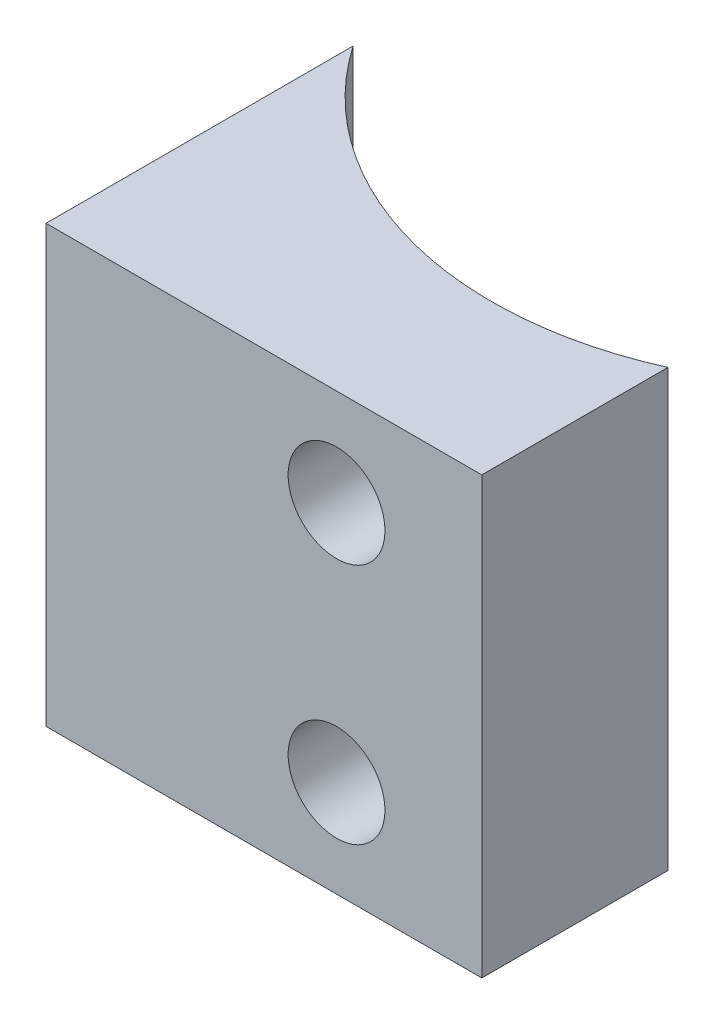
ISO-10303-21;
HEADER;
FILE_DESCRIPTION(('STEP AP214'),'2;1');
FILE_NAME('part.step','',(''),(''),'','','');
FILE_SCHEMA(('AUTOMOTIVE_DESIGN { 1 0 10303 214 1 1 1 1 }'));
ENDSEC;
DATA;
#1=APPLICATION_CONTEXT('core data for automotive mechanical design processes');
#2=APPLICATION_PROTOCOL_DEFINITION('international standard','automotive_design',2000,#1);
#3=PRODUCT_CONTEXT('',#1,'mechanical');
#4=PRODUCT('Part','Part','',(#3));
#5=PRODUCT_RELATED_PRODUCT_CATEGORY('part','',(#4));
#6=PRODUCT_DEFINITION_FORMATION('','',#4);
#7=PRODUCT_DEFINITION_CONTEXT('part definition',#1,'design');
#8=PRODUCT_DEFINITION('design','',#6,#7);
#9=PRODUCT_DEFINITION_SHAPE('','',#8);
#10=(LENGTH_UNIT() NAMED_UNIT(*) SI_UNIT(.MILLI.,.METRE.));
#11=(NAMED_UNIT(*) PLANE_ANGLE_UNIT() SI_UNIT($,.RADIAN.));
#12=(NAMED_UNIT(*) SI_UNIT($,.STERADIAN.) SOLID_ANGLE_UNIT());
#13=UNCERTAINTY_MEASURE_WITH_UNIT(LENGTH_MEASURE(1.E-05),#10,'distance_accuracy_value','');
#14=(GEOMETRIC_REPRESENTATION_CONTEXT(3) GLOBAL_UNCERTAINTY_ASSIGNED_CONTEXT((#13)) GLOBAL_UNIT_ASSIGNED_CONTEXT((#10,
#11,#12)) REPRESENTATION_CONTEXT('',''));
#15=CARTESIAN_POINT('',(0.,0.,0.));
#16=DIRECTION('',(0.,0.,1.));
#17=DIRECTION('',(1.,0.,0.));
#18=AXIS2_PLACEMENT_3D('',#15,#16,#17);
#19=CARTESIAN_POINT('',(0.,-30.,0.));
#20=DIRECTION('',(0.,1.,0.));
#21=DIRECTION('',(0.,0.,1.));
#22=AXIS2_PLACEMENT_3D('',#19,#20,#21);
#23=CYLINDRICAL_SURFACE('',#22,36.5);
#24=CARTESIAN_POINT('',(5.,-20.,36.1559123795818));
#25=CARTESIAN_POINT('',(5.00000174021357,-19.8602338352344,36.1559117231919));
#26=CARTESIAN_POINT('',(4.99413759806774,-19.7204926591787,36.1567244328982));
#27=CARTESIAN_POINT('',(4.97072698097059,-19.441966942433,36.1599505039834));
#28=CARTESIAN_POINT('',(4.95317794339427,-19.3031826183383,36.1623642164793));
#29=CARTESIAN_POINT('',(4.90650841531224,-19.0275106625819,36.1687258133522));
#30=CARTESIAN_POINT('',(4.87737963825514,-18.8906244619859,36.172674796336));
#31=CARTESIAN_POINT('',(4.80775640545662,-18.6197691802201,36.1819942984555));
#32=CARTESIAN_POINT('',(4.76725778332805,-18.4858011878326,36.1873653386513));
#33=CARTESIAN_POINT('',(4.67524918463149,-18.2219257095405,36.1993673004681));
#34=CARTESIAN_POINT('',(4.62375131772126,-18.0920139367682,36.205996835659));
#35=CARTESIAN_POINT('',(4.51007164218422,-17.8369569378413,36.2203331703413));
#36=CARTESIAN_POINT('',(4.44788589768718,-17.7118134884632,36.2280403664917));
#37=CARTESIAN_POINT('',(4.31332539216836,-17.4672761473142,36.2443073031495));
#38=CARTESIAN_POINT('',(4.24095608383687,-17.347879224238,36.2528665867021));
#39=CARTESIAN_POINT('',(4.08648564196615,-17.115541118051,36.2706035061156));
#40=CARTESIAN_POINT('',(4.00438090130522,-17.0026023509,36.279781370623));
#41=CARTESIAN_POINT('',(3.83054594615143,-16.7833875181193,36.2985481878879));
#42=CARTESIAN_POINT('',(3.73876423880966,-16.6771524556949,36.3081391607627));
#43=CARTESIAN_POINT('',(3.54656514669067,-16.4727398263521,36.3274167037392));
#44=CARTESIAN_POINT('',(3.44614457966845,-16.3745652548796,36.3371033078947));
#45=CARTESIAN_POINT('',(3.23742697872434,-16.1870295917347,36.3562930309955));
#46=CARTESIAN_POINT('',(3.12913243813219,-16.0976657310461,36.3657962068284));
#47=CARTESIAN_POINT('',(2.90534790068753,-15.9283110031673,36.3843587554896));
#48=CARTESIAN_POINT('',(2.78985526480078,-15.8483236049971,36.3934179633458));
#49=CARTESIAN_POINT('',(2.55207984561808,-15.6980541225224,36.4108657665965));
#50=CARTESIAN_POINT('',(2.42977393223369,-15.6278083288675,36.419251807839));
#51=CARTESIAN_POINT('',(2.17957364156575,-15.4978514168236,36.4350817279843));
#52=CARTESIAN_POINT('',(2.05167720514956,-15.438144221565,36.4425252557339));
#53=CARTESIAN_POINT('',(1.79128345394976,-15.3297567004876,36.4562515063575));
#54=CARTESIAN_POINT('',(1.65878802225925,-15.2810719214759,36.4625346978321));
#55=CARTESIAN_POINT('',(1.39009491155222,-15.1950468905879,36.4737684227831));
#56=CARTESIAN_POINT('',(1.25389589450601,-15.1577107997157,36.4787184673847));
#57=CARTESIAN_POINT('',(0.843028196941309,-15.0636340584156,36.4912817337303));
#58=CARTESIAN_POINT('',(0.564147727521053,-15.0240198116055,36.4967135006696));
#59=CARTESIAN_POINT('',(0.00380071885447398,-14.9921214878824,36.5010771134938));
#60=CARTESIAN_POINT('',(-0.277665698798489,-14.999835196829,36.5000092634499));
#61=CARTESIAN_POINT('',(-0.833392123587025,-15.0620787384919,36.4915351399092));
#62=CARTESIAN_POINT('',(-1.10768777387907,-15.1162946220146,36.4841713729705));
#63=CARTESIAN_POINT('',(-1.64323991714871,-15.2695285104743,36.4639773139639));
#64=CARTESIAN_POINT('',(-1.90449612093993,-15.3685475085565,36.4511469007179));
#65=CARTESIAN_POINT('',(-2.40752875981016,-15.6089006238871,36.4213886835511));
#66=CARTESIAN_POINT('',(-2.64924028116171,-15.7503689448048,36.4044479177398));
#67=CARTESIAN_POINT('',(-3.10561063137794,-16.0715083503412,36.3683608161024));
#68=CARTESIAN_POINT('',(-3.32026797084505,-16.2511815367673,36.3492143589587));
#69=CARTESIAN_POINT('',(-3.71828543660718,-16.6453847105825,36.310669827647));
#70=CARTESIAN_POINT('',(-3.90137429423767,-16.8601886239288,36.2912709779823));
#71=CARTESIAN_POINT('',(-4.22894445135169,-17.3176195984736,36.2545622390918));
#72=CARTESIAN_POINT('',(-4.37342558167297,-17.5602467815749,36.237252359019));
#73=CARTESIAN_POINT('',(-4.61970417598658,-18.066697401167,36.2066819437005));
#74=CARTESIAN_POINT('',(-4.72147710508501,-18.330532917956,36.1934237372347));
#75=CARTESIAN_POINT('',(-4.87919504088549,-18.8717726121589,36.1725012170257));
#76=CARTESIAN_POINT('',(-4.93514271873473,-19.1491759977048,36.1648365772373));
#77=CARTESIAN_POINT('',(-4.99925692944306,-19.7072730453106,36.156029729936));
#78=CARTESIAN_POINT('',(-5.0078064923179,-19.9879219099059,36.1548352381693));
#79=CARTESIAN_POINT('',(-4.97789502900764,-20.5466481296306,36.1589654177268));
#80=CARTESIAN_POINT('',(-4.93943521226418,-20.8247255507318,36.1642899213326));
#81=CARTESIAN_POINT('',(-4.81692033816778,-21.3692497524291,36.1808103055875));
#82=CARTESIAN_POINT('',(-4.73305319594198,-21.6357396109842,36.19198198181));
#83=CARTESIAN_POINT('',(-4.52229864087699,-22.1508766063494,36.2189181815632));
#84=CARTESIAN_POINT('',(-4.39540943248913,-22.399522997928,36.234682896783));
#85=CARTESIAN_POINT('',(-4.10128102391648,-22.873640605039,36.2691532163959));
#86=CARTESIAN_POINT('',(-3.93379212009354,-23.0989555849652,36.2878767605421));
#87=CARTESIAN_POINT('',(-3.56356800419505,-23.5184148268523,36.3260997949745));
#88=CARTESIAN_POINT('',(-3.36083113868349,-23.7125576257446,36.345599321628));
#89=CARTESIAN_POINT('',(-2.92419031406798,-24.0655211244958,36.3833392546156));
#90=CARTESIAN_POINT('',(-2.69008116831329,-24.2240891453539,36.4015700561729));
#91=CARTESIAN_POINT('',(-2.19831660768835,-24.4996467048848,36.4345718461417));
#92=CARTESIAN_POINT('',(-1.94066174731427,-24.6166372223813,36.449342916));
#93=CARTESIAN_POINT('',(-1.40998883219887,-24.805312745148,36.4737202488671));
#94=CARTESIAN_POINT('',(-1.13702205226308,-24.8771401521838,36.4833427312055));
#95=CARTESIAN_POINT('',(-0.582606536261225,-24.973894185976,36.4964001948081));
#96=CARTESIAN_POINT('',(-0.301158264479778,-24.9988233752623,36.49983551414));
#97=CARTESIAN_POINT('',(0.119716113689637,-25.000524816167,36.5000735331014));
#98=CARTESIAN_POINT('',(0.25929187738066,-24.9952255218178,36.4993450388926));
#99=CARTESIAN_POINT('',(0.537480968028806,-24.9729815917728,36.4963065650426));
#100=CARTESIAN_POINT('',(0.676094634719784,-24.9560413027524,36.4939971756991));
#101=CARTESIAN_POINT('',(0.951426540163292,-24.9106285932103,36.4878579312111));
#102=CARTESIAN_POINT('',(1.08814407589155,-24.8821520076952,36.4840275269387));
#103=CARTESIAN_POINT('',(1.35862865469653,-24.8138937435322,36.4749561776786));
#104=CARTESIAN_POINT('',(1.49239674953816,-24.774116167425,36.469715744603));
#105=CARTESIAN_POINT('',(1.75607046857505,-24.6835506026045,36.4579707724678));
#106=CARTESIAN_POINT('',(1.88597668791359,-24.6327643205205,36.4514664293626));
#107=CARTESIAN_POINT('',(2.14099896189676,-24.5205666097182,36.4373767986452));
#108=CARTESIAN_POINT('',(2.26611673000621,-24.4591590258955,36.4297919023663));
#109=CARTESIAN_POINT('',(2.51079429479419,-24.3261196301285,36.4137467341971));
#110=CARTESIAN_POINT('',(2.63035199923179,-24.2544840100109,36.4052861365839));
#111=CARTESIAN_POINT('',(2.86299823429763,-24.1015379630367,36.3877293471302));
#112=CARTESIAN_POINT('',(2.97608905788089,-24.0202309972317,36.3786333831442));
#113=CARTESIAN_POINT('',(3.19597658039478,-23.8477806358358,36.3599781420283));
#114=CARTESIAN_POINT('',(3.30271397379898,-23.7565619552586,36.3504156738953));
#115=CARTESIAN_POINT('',(3.50809934419786,-23.5655157519083,36.3311694900764));
#116=CARTESIAN_POINT('',(3.60675022882862,-23.4656913501863,36.3214858194272));
#117=CARTESIAN_POINT('',(3.79537809271737,-23.2580350212744,36.3022602717941));
#118=CARTESIAN_POINT('',(3.88534980584364,-23.1501983019365,36.2927184838312));
#119=CARTESIAN_POINT('',(4.05589042510998,-22.927359068985,36.2740556183341));
#120=CARTESIAN_POINT('',(4.13646279073837,-22.8123592158649,36.2649343867638));
#121=CARTESIAN_POINT('',(4.288054455279,-22.5753591938993,36.2473232621816));
#122=CARTESIAN_POINT('',(4.3590236632469,-22.4533267228031,36.2388367756106));
#123=CARTESIAN_POINT('',(4.49039002486203,-22.203697797071,36.2227936047348));
#124=CARTESIAN_POINT('',(4.55079106058788,-22.0761034071377,36.215236579309));
#125=CARTESIAN_POINT('',(4.66056840975539,-21.8163067362623,36.2012729796561));
#126=CARTESIAN_POINT('',(4.70995309477017,-21.6841080431705,36.1948655325681));
#127=CARTESIAN_POINT('',(4.79737679063679,-21.4160013819336,36.183381741417));
#128=CARTESIAN_POINT('',(4.83541841803083,-21.2800942771281,36.1783050904071));
#129=CARTESIAN_POINT('',(4.91155163681099,-20.9557870898374,36.1680613219813));
#130=CARTESIAN_POINT('',(4.9446842822747,-20.7661808515564,36.1635256649017));
#131=CARTESIAN_POINT('',(4.98890715890584,-20.3843673133332,36.1574516597051));
#132=CARTESIAN_POINT('',(4.99999760743591,-20.1921600390591,36.1559132820314));
#133=CARTESIAN_POINT('',(5.,-20.,36.1559123795818));
#134=B_SPLINE_CURVE_WITH_KNOTS('',3,(#24,#25,#26,#27,#28,#29,#30,#31,#32,#33,#34,#35,#36,#37,
#38,#39,#40,#41,#42,#43,#44,#45,#46,#47,#48,#49,#50,#51,#52,#53,#54,#55,#56,#57,#58,#59,#60,#61,
#62,#63,#64,#65,#66,#67,#68,#69,#70,#71,#72,#73,#74,#75,#76,#77,#78,#79,#80,#81,#82,#83,#84,#85,
#86,#87,#88,#89,#90,#91,#92,#93,#94,#95,#96,#97,#98,#99,#100,#101,#102,#103,#104,#105,#106,#107,
#108,#109,#110,#111,#112,#113,#114,#115,#116,#117,#118,#119,#120,#121,#122,#123,#124,#125,#126,
#127,#128,#129,#130,#131,#132,#133),.UNSPECIFIED.,.T.,.F.,(4,2,2,2,2,2,2,2,2,2,2,2,2,2,2,2,2,2,
2,2,2,2,2,2,2,2,2,2,2,2,2,2,2,2,2,2,2,2,2,2,2,2,2,2,2,2,2,2,2,2,2,2,2,2,4),(0.,
0.419130226392587,0.838352402904291,1.25787511965044,1.67755176818687,2.09676873219502,
2.5161404072572,2.93528838226791,3.35459214595726,3.77625195907237,4.19806776708834,
4.61975058207854,5.04158891840061,5.46495878930041,5.88848593425413,6.31184166242342,
6.73535242753266,7.57614239505028,8.41689302825007,9.25201179880596,10.0871490822455,
10.9249549829796,11.7628069868085,12.607534140547,13.4522649954511,14.2974804669503,
15.1426466674568,15.9809729091492,16.8192775831175,17.6541392164489,18.4890356974618,
19.3292035517609,20.1694108278795,21.0154091967708,21.8613876477267,22.7046851268754,
23.5479365267072,23.9665636290435,24.3850345034853,24.8036565949097,25.2221269098615,
25.6405323976075,26.0587867389754,26.4771972157747,26.8954584054041,27.3171539287674,
27.7386971533702,28.1604945635726,28.5821362355135,29.0058987839989,29.4295053405923,
29.8527888840152,30.2759747114933,30.8522291650916,31.4284779360977),.UNSPECIFIED.);
#135=CARTESIAN_POINT('',(5.,-20.,36.1559123795818));
#136=VERTEX_POINT('',#135);
#137=EDGE_CURVE('E105',#136,#136,#134,.T.);
#138=ORIENTED_EDGE('',*,*,#137,.T.);
#139=EDGE_LOOP('',(#138));
#140=FACE_BOUND('',#139,.T.);
#141=CARTESIAN_POINT('',(5.,4.99999999999999,36.1559123795818));
#142=CARTESIAN_POINT('',(5.00000174021357,5.13976616476563,36.1559117231919));
#143=CARTESIAN_POINT('',(4.99413759806774,5.27950734082131,36.1567244328982));
#144=CARTESIAN_POINT('',(4.97072698097059,5.55803305756701,36.1599505039834));
#145=CARTESIAN_POINT('',(4.95317794339427,5.69681738166171,36.1623642164793));
#146=CARTESIAN_POINT('',(4.90650841531224,5.97248933741812,36.1687258133522));
#147=CARTESIAN_POINT('',(4.87737963825514,6.10937553801414,36.172674796336));
#148=CARTESIAN_POINT('',(4.80775640545662,6.38023081977986,36.1819942984555));
#149=CARTESIAN_POINT('',(4.76725778332805,6.51419881216738,36.1873653386513));
#150=CARTESIAN_POINT('',(4.67524918463149,6.7780742904595,36.1993673004681));
#151=CARTESIAN_POINT('',(4.62375131772126,6.90798606323181,36.205996835659));
#152=CARTESIAN_POINT('',(4.51007164218422,7.16304306215874,36.2203331703413));
#153=CARTESIAN_POINT('',(4.44788589768718,7.28818651153683,36.2280403664917));
#154=CARTESIAN_POINT('',(4.31332539216836,7.53272385268584,36.2443073031494));
#155=CARTESIAN_POINT('',(4.24095608383687,7.65212077576195,36.2528665867021));
#156=CARTESIAN_POINT('',(4.08648564196615,7.88445888194896,36.2706035061156));
#157=CARTESIAN_POINT('',(4.00438090130522,7.99739764909997,36.279781370623));
#158=CARTESIAN_POINT('',(3.83054594615143,8.21661248188067,36.2985481878879));
#159=CARTESIAN_POINT('',(3.73876423880966,8.32284754430513,36.3081391607627));
#160=CARTESIAN_POINT('',(3.54656514669067,8.52726017364795,36.3274167037392));
#161=CARTESIAN_POINT('',(3.44614457966844,8.62543474512043,36.3371033078947));
#162=CARTESIAN_POINT('',(3.23742697872434,8.81297040826534,36.3562930309955));
#163=CARTESIAN_POINT('',(3.12913243813219,8.90233426895392,36.3657962068284));
#164=CARTESIAN_POINT('',(2.90534790068752,9.07168899683274,36.3843587554896));
#165=CARTESIAN_POINT('',(2.78985526480078,9.15167639500287,36.3934179633458));
#166=CARTESIAN_POINT('',(2.55207984561808,9.30194587747759,36.4108657665965));
#167=CARTESIAN_POINT('',(2.42977393223368,9.37219167113254,36.419251807839));
#168=CARTESIAN_POINT('',(2.17957364156574,9.50214858317637,36.4350817279843));
#169=CARTESIAN_POINT('',(2.05167720514956,9.56185577843497,36.4425252557339));
#170=CARTESIAN_POINT('',(1.79128345394975,9.67024329951239,36.4562515063575));
#171=CARTESIAN_POINT('',(1.65878802225925,9.71892807852415,36.4625346978321));
#172=CARTESIAN_POINT('',(1.39009491155222,9.80495310941215,36.4737684227831));
#173=CARTESIAN_POINT('',(1.25389589450601,9.84228920028433,36.4787184673847));
#174=CARTESIAN_POINT('',(0.843028196941306,9.93636594158444,36.4912817337303));
#175=CARTESIAN_POINT('',(0.56414772752105,9.97598018839449,36.4967135006696));
#176=CARTESIAN_POINT('',(0.00380071885447094,10.0078785121176,36.5010771134938));
#177=CARTESIAN_POINT('',(-0.277665698798492,10.000164803171,36.5000092634499));
#178=CARTESIAN_POINT('',(-0.833392123587028,9.93792126150811,36.4915351399092));
#179=CARTESIAN_POINT('',(-1.10768777387907,9.88370537798545,36.4841713729705));
#180=CARTESIAN_POINT('',(-1.64323991714872,9.73047148952575,36.4639773139639));
#181=CARTESIAN_POINT('',(-1.90449612093993,9.6314524914435,36.4511469007179));
#182=CARTESIAN_POINT('',(-2.40752875981016,9.39109937611294,36.4213886835511));
#183=CARTESIAN_POINT('',(-2.64924028116171,9.24963105519517,36.4044479177398));
#184=CARTESIAN_POINT('',(-3.10561063137793,8.92849164965878,36.3683608161024));
#185=CARTESIAN_POINT('',(-3.32026797084505,8.74881846323266,36.3492143589587));
#186=CARTESIAN_POINT('',(-3.71828543660718,8.35461528941753,36.310669827647));
#187=CARTESIAN_POINT('',(-3.90137429423767,8.13981137607119,36.2912709779823));
#188=CARTESIAN_POINT('',(-4.22894445135168,7.68238040152639,36.2545622390918));
#189=CARTESIAN_POINT('',(-4.37342558167297,7.43975321842515,36.237252359019));
#190=CARTESIAN_POINT('',(-4.61970417598658,6.93330259883304,36.2066819437005));
#191=CARTESIAN_POINT('',(-4.72147710508501,6.66946708204402,36.1934237372347));
#192=CARTESIAN_POINT('',(-4.87919504088549,6.12822738784106,36.1725012170257));
#193=CARTESIAN_POINT('',(-4.93514271873473,5.85082400229524,36.1648365772373));
#194=CARTESIAN_POINT('',(-4.99925692944306,5.29272695468939,36.156029729936));
#195=CARTESIAN_POINT('',(-5.0078064923179,5.01207809009406,36.1548352381693));
#196=CARTESIAN_POINT('',(-4.97789502900764,4.45335187036936,36.1589654177268));
#197=CARTESIAN_POINT('',(-4.93943521226418,4.1752744492682,36.1642899213326));
#198=CARTESIAN_POINT('',(-4.81692033816778,3.6307502475709,36.1808103055875));
#199=CARTESIAN_POINT('',(-4.73305319594198,3.36426038901576,36.19198198181));
#200=CARTESIAN_POINT('',(-4.522298640877,2.84912339365062,36.2189181815632));
#201=CARTESIAN_POINT('',(-4.39540943248913,2.60047700207202,36.234682896783));
#202=CARTESIAN_POINT('',(-4.10128102391648,2.12635939496099,36.2691532163959));
#203=CARTESIAN_POINT('',(-3.93379212009354,1.90104441503478,36.2878767605421));
#204=CARTESIAN_POINT('',(-3.56356800419505,1.4815851731477,36.3260997949745));
#205=CARTESIAN_POINT('',(-3.36083113868349,1.28744237425541,36.345599321628));
#206=CARTESIAN_POINT('',(-2.92419031406798,0.93447887550422,36.3833392546156));
#207=CARTESIAN_POINT('',(-2.69008116831328,0.775910854646123,36.4015700561729));
#208=CARTESIAN_POINT('',(-2.19831660768835,0.500353295115159,36.4345718461417));
#209=CARTESIAN_POINT('',(-1.94066174731426,0.383362777618696,36.449342916));
#210=CARTESIAN_POINT('',(-1.40998883219887,0.194687254852028,36.4737202488671));
#211=CARTESIAN_POINT('',(-1.13702205226307,0.122859847816214,36.4833427312055));
#212=CARTESIAN_POINT('',(-0.582606536261221,0.0261058140240413,36.4964001948081));
#213=CARTESIAN_POINT('',(-0.301158264479774,0.00117662473770327,36.49983551414));
#214=CARTESIAN_POINT('',(0.119716113689641,-0.000524816167034167,36.5000735331014));
#215=CARTESIAN_POINT('',(0.259291877380664,0.00477447818215337,36.4993450388926));
#216=CARTESIAN_POINT('',(0.537480968028809,0.0270184082271715,36.4963065650426));
#217=CARTESIAN_POINT('',(0.676094634719785,0.0439586972476106,36.4939971756991));
#218=CARTESIAN_POINT('',(0.951426540163293,0.0893714067897085,36.4878579312111));
#219=CARTESIAN_POINT('',(1.08814407589155,0.117847992304833,36.4840275269387));
#220=CARTESIAN_POINT('',(1.35862865469653,0.186106256467825,36.4749561776786));
#221=CARTESIAN_POINT('',(1.49239674953816,0.225883832574971,36.469715744603));
#222=CARTESIAN_POINT('',(1.75607046857506,0.316449397395538,36.4579707724678));
#223=CARTESIAN_POINT('',(1.88597668791359,0.367235679479519,36.4514664293626));
#224=CARTESIAN_POINT('',(2.14099896189677,0.479433390281778,36.4373767986452));
#225=CARTESIAN_POINT('',(2.26611673000621,0.540840974104509,36.4297919023663));
#226=CARTESIAN_POINT('',(2.51079429479419,0.673880369871466,36.4137467341971));
#227=CARTESIAN_POINT('',(2.6303519992318,0.74551598998915,36.4052861365839));
#228=CARTESIAN_POINT('',(2.86299823429764,0.898462036963294,36.3877293471302));
#229=CARTESIAN_POINT('',(2.97608905788089,0.979769002768292,36.3786333831442));
#230=CARTESIAN_POINT('',(3.19597658039478,1.15221936416422,36.3599781420283));
#231=CARTESIAN_POINT('',(3.30271397379898,1.24343804474136,36.3504156738953));
#232=CARTESIAN_POINT('',(3.50809934419786,1.43448424809176,36.3311694900764));
#233=CARTESIAN_POINT('',(3.60675022882862,1.53430864981366,36.3214858194272));
#234=CARTESIAN_POINT('',(3.79537809271737,1.74196497872559,36.3022602717941));
#235=CARTESIAN_POINT('',(3.88534980584365,1.84980169806353,36.2927184838312));
#236=CARTESIAN_POINT('',(4.05589042510998,2.072640931015,36.2740556183341));
#237=CARTESIAN_POINT('',(4.13646279073837,2.18764078413515,36.2649343867638));
#238=CARTESIAN_POINT('',(4.288054455279,2.42464080610072,36.2473232621816));
#239=CARTESIAN_POINT('',(4.3590236632469,2.54667327719687,36.2388367756106));
#240=CARTESIAN_POINT('',(4.49039002486203,2.79630220292904,36.2227936047348));
#241=CARTESIAN_POINT('',(4.55079106058788,2.92389659286227,36.215236579309));
#242=CARTESIAN_POINT('',(4.66056840975539,3.18369326373769,36.2012729796561));
#243=CARTESIAN_POINT('',(4.70995309477017,3.31589195682948,36.1948655325681));
#244=CARTESIAN_POINT('',(4.79737679063679,3.58399861806638,36.183381741417));
#245=CARTESIAN_POINT('',(4.83541841803083,3.71990572287189,36.1783050904071));
#246=CARTESIAN_POINT('',(4.91155163681099,4.04421291016259,36.1680613219812));
#247=CARTESIAN_POINT('',(4.9446842822747,4.23381914844358,36.1635256649017));
#248=CARTESIAN_POINT('',(4.98890715890583,4.61563268666683,36.1574516597051));
#249=CARTESIAN_POINT('',(4.99999760743591,4.80783996094092,36.1559132820314));
#250=CARTESIAN_POINT('',(5.,4.99999999999999,36.1559123795818));
#251=B_SPLINE_CURVE_WITH_KNOTS('',3,(#141,#142,#143,#144,#145,#146,#147,#148,#149,#150,#151,
#152,#153,#154,#155,#156,#157,#158,#159,#160,#161,#162,#163,#164,#165,#166,#167,#168,#169,#170,
#171,#172,#173,#174,#175,#176,#177,#178,#179,#180,#181,#182,#183,#184,#185,#186,#187,#188,#189,
#190,#191,#192,#193,#194,#195,#196,#197,#198,#199,#200,#201,#202,#203,#204,#205,#206,#207,#208,
#209,#210,#211,#212,#213,#214,#215,#216,#217,#218,#219,#220,#221,#222,#223,#224,#225,#226,#227,
#228,#229,#230,#231,#232,#233,#234,#235,#236,#237,#238,#239,#240,#241,#242,#243,#244,#245,#246,
#247,#248,#249,#250),.UNSPECIFIED.,.T.,.F.,(4,2,2,2,2,2,2,2,2,2,2,2,2,2,2,2,2,2,2,2,2,2,2,2,2,2,
2,2,2,2,2,2,2,2,2,2,2,2,2,2,2,2,2,2,2,2,2,2,2,2,2,2,2,2,4),(0.,0.419130226392588,
0.838352402904291,1.25787511965044,1.67755176818687,2.09676873219502,2.5161404072572,
2.9352883822679,3.35459214595726,3.77625195907237,4.19806776708834,4.61975058207854,
5.04158891840062,5.46495878930042,5.88848593425413,6.31184166242342,6.73535242753267,
7.57614239505028,8.41689302825007,9.25201179880596,10.0871490822455,10.9249549829796,
11.7628069868085,12.607534140547,13.452264995451,14.2974804669503,15.1426466674568,
15.9809729091492,16.8192775831175,17.6541392164489,18.4890356974618,19.3292035517609,
20.1694108278795,21.0154091967708,21.8613876477267,22.7046851268755,23.5479365267072,
23.9665636290435,24.3850345034853,24.8036565949097,25.2221269098615,25.6405323976075,
26.0587867389754,26.4771972157747,26.8954584054041,27.3171539287674,27.7386971533702,
28.1604945635726,28.5821362355135,29.0058987839989,29.4295053405923,29.8527888840152,
30.2759747114933,30.8522291650916,31.4284779360977),.UNSPECIFIED.);
#252=CARTESIAN_POINT('',(5.,4.99999999999999,36.1559123795818));
#253=VERTEX_POINT('',#252);
#254=EDGE_CURVE('E103',#253,#253,#251,.T.);
#255=ORIENTED_EDGE('',*,*,#254,.T.);
#256=EDGE_LOOP('',(#255));
#257=FACE_BOUND('',#256,.T.);
#258=DIRECTION('',(0.,1.,0.));
#259=VECTOR('',#258,1.);
#260=CARTESIAN_POINT('',(-30.,-30.,20.7906228862918));
#261=LINE('',#260,#259);
#262=CARTESIAN_POINT('',(-30.,-30.,20.7906228862918));
#263=VERTEX_POINT('',#262);
#264=CARTESIAN_POINT('',(-30.,15.,20.7906228862918));
#265=VERTEX_POINT('',#264);
#266=EDGE_CURVE('E44',#263,#265,#261,.T.);
#267=ORIENTED_EDGE('',*,*,#266,.T.);
#268=CARTESIAN_POINT('',(0.,15.,0.));
#269=DIRECTION('',(0.,1.,0.));
#270=DIRECTION('',(0.,0.,1.));
#271=AXIS2_PLACEMENT_3D('',#268,#269,#270);
#272=CIRCLE('',#271,36.5);
#273=CARTESIAN_POINT('',(15.,15.,33.2753662639497));
#274=VERTEX_POINT('',#273);
#275=EDGE_CURVE('E84',#265,#274,#272,.T.);
#276=ORIENTED_EDGE('',*,*,#275,.T.);
#277=DIRECTION('',(0.,1.,0.));
#278=VECTOR('',#277,1.);
#279=CARTESIAN_POINT('',(15.,-30.,33.2753662639497));
#280=LINE('',#279,#278);
#281=CARTESIAN_POINT('',(15.,-30.,33.2753662639497));
#282=VERTEX_POINT('',#281);
#283=EDGE_CURVE('E11',#282,#274,#280,.T.);
#284=ORIENTED_EDGE('',*,*,#283,.F.);
#285=CARTESIAN_POINT('',(0.,-30.,0.));
#286=DIRECTION('',(0.,1.,0.));
#287=DIRECTION('',(0.,0.,1.));
#288=AXIS2_PLACEMENT_3D('',#285,#286,#287);
#289=CIRCLE('',#288,36.5);
#290=EDGE_CURVE('E86',#263,#282,#289,.T.);
#291=ORIENTED_EDGE('',*,*,#290,.F.);
#292=EDGE_LOOP('',(#267,#276,#284,#291));
#293=FACE_BOUND('',#292,.T.);
#294=ADVANCED_FACE('F41',(#140,#257,#293),#23,.F.);
#295=CARTESIAN_POINT('',(15.,-30.,0.));
#296=DIRECTION('',(-1.,0.,0.));
#297=DIRECTION('',(0.,0.,1.));
#298=AXIS2_PLACEMENT_3D('',#295,#296,#297);
#299=PLANE('',#298);
#300=ORIENTED_EDGE('',*,*,#283,.T.);
#301=DIRECTION('',(0.,0.,1.));
#302=VECTOR('',#301,1.);
#303=CARTESIAN_POINT('',(15.,15.,0.));
#304=LINE('',#303,#302);
#305=CARTESIAN_POINT('',(15.,15.,52.5));
#306=VERTEX_POINT('',#305);
#307=EDGE_CURVE('E102',#274,#306,#304,.T.);
#308=ORIENTED_EDGE('',*,*,#307,.T.);
#309=DIRECTION('',(0.,1.,0.));
#310=VECTOR('',#309,1.);
#311=CARTESIAN_POINT('',(15.,-30.,52.5));
#312=LINE('',#311,#310);
#313=CARTESIAN_POINT('',(15.,-30.,52.5));
#314=VERTEX_POINT('',#313);
#315=EDGE_CURVE('E49',#314,#306,#312,.T.);
#316=ORIENTED_EDGE('',*,*,#315,.F.);
#317=DIRECTION('',(0.,0.,1.));
#318=VECTOR('',#317,1.);
#319=CARTESIAN_POINT('',(15.,-30.,0.));
#320=LINE('',#319,#318);
#321=EDGE_CURVE('E60',#282,#314,#320,.T.);
#322=ORIENTED_EDGE('',*,*,#321,.F.);
#323=EDGE_LOOP('',(#300,#308,#316,#322));
#324=FACE_BOUND('',#323,.T.);
#325=ADVANCED_FACE('F125',(#324),#299,.F.);
#326=CARTESIAN_POINT('',(0.,-30.,52.5));
#327=DIRECTION('',(0.,0.,1.));
#328=DIRECTION('',(1.,0.,0.));
#329=AXIS2_PLACEMENT_3D('',#326,#327,#328);
#330=PLANE('',#329);
#331=CARTESIAN_POINT('',(0.,-20.,52.5));
#332=DIRECTION('',(0.,0.,1.));
#333=DIRECTION('',(1.,0.,0.));
#334=AXIS2_PLACEMENT_3D('',#331,#332,#333);
#335=CIRCLE('',#334,5.);
#336=CARTESIAN_POINT('',(5.,-20.,52.5));
#337=VERTEX_POINT('',#336);
#338=EDGE_CURVE('E156',#337,#337,#335,.T.);
#339=ORIENTED_EDGE('',*,*,#338,.F.);
#340=EDGE_LOOP('',(#339));
#341=FACE_BOUND('',#340,.T.);
#342=CARTESIAN_POINT('',(0.,4.99999999999999,52.5));
#343=DIRECTION('',(0.,0.,1.));
#344=DIRECTION('',(1.,0.,0.));
#345=AXIS2_PLACEMENT_3D('',#342,#343,#344);
#346=CIRCLE('',#345,5.);
#347=CARTESIAN_POINT('',(5.,4.99999999999999,52.5));
#348=VERTEX_POINT('',#347);
#349=EDGE_CURVE('E159',#348,#348,#346,.T.);
#350=ORIENTED_EDGE('',*,*,#349,.F.);
#351=EDGE_LOOP('',(#350));
#352=FACE_BOUND('',#351,.T.);
#353=ORIENTED_EDGE('',*,*,#315,.T.);
#354=DIRECTION('',(1.,0.,0.));
#355=VECTOR('',#354,1.);
#356=CARTESIAN_POINT('',(0.,15.,52.5));
#357=LINE('',#356,#355);
#358=CARTESIAN_POINT('',(-30.,15.,52.5));
#359=VERTEX_POINT('',#358);
#360=EDGE_CURVE('E100',#359,#306,#357,.T.);
#361=ORIENTED_EDGE('',*,*,#360,.F.);
#362=DIRECTION('',(0.,1.,0.));
#363=VECTOR('',#362,1.);
#364=CARTESIAN_POINT('',(-30.,-30.,52.5));
#365=LINE('',#364,#363);
#366=CARTESIAN_POINT('',(-30.,-30.,52.5));
#367=VERTEX_POINT('',#366);
#368=EDGE_CURVE('E89',#367,#359,#365,.T.);
#369=ORIENTED_EDGE('',*,*,#368,.F.);
#370=DIRECTION('',(1.,0.,0.));
#371=VECTOR('',#370,1.);
#372=CARTESIAN_POINT('',(0.,-30.,52.5));
#373=LINE('',#372,#371);
#374=EDGE_CURVE('E116',#367,#314,#373,.T.);
#375=ORIENTED_EDGE('',*,*,#374,.T.);
#376=EDGE_LOOP('',(#353,#361,#369,#375));
#377=FACE_BOUND('',#376,.T.);
#378=ADVANCED_FACE('F121',(#341,#352,#377),#330,.T.);
#379=CARTESIAN_POINT('',(-30.,-30.,0.));
#380=DIRECTION('',(-1.,0.,0.));
#381=DIRECTION('',(0.,0.,1.));
#382=AXIS2_PLACEMENT_3D('',#379,#380,#381);
#383=PLANE('',#382);
#384=ORIENTED_EDGE('',*,*,#368,.T.);
#385=DIRECTION('',(0.,0.,1.));
#386=VECTOR('',#385,1.);
#387=CARTESIAN_POINT('',(-30.,15.,0.));
#388=LINE('',#387,#386);
#389=EDGE_CURVE('E95',#265,#359,#388,.T.);
#390=ORIENTED_EDGE('',*,*,#389,.F.);
#391=ORIENTED_EDGE('',*,*,#266,.F.);
#392=DIRECTION('',(0.,0.,1.));
#393=VECTOR('',#392,1.);
#394=CARTESIAN_POINT('',(-30.,-30.,0.));
#395=LINE('',#394,#393);
#396=EDGE_CURVE('E118',#263,#367,#395,.T.);
#397=ORIENTED_EDGE('',*,*,#396,.T.);
#398=EDGE_LOOP('',(#384,#390,#391,#397));
#399=FACE_BOUND('',#398,.T.);
#400=ADVANCED_FACE('F93',(#399),#383,.T.);
#401=CARTESIAN_POINT('',(0.,-30.,0.));
#402=DIRECTION('',(0.,1.,0.));
#403=DIRECTION('',(0.,0.,1.));
#404=AXIS2_PLACEMENT_3D('',#401,#402,#403);
#405=PLANE('',#404);
#406=ORIENTED_EDGE('',*,*,#290,.T.);
#407=ORIENTED_EDGE('',*,*,#321,.T.);
#408=ORIENTED_EDGE('',*,*,#374,.F.);
#409=ORIENTED_EDGE('',*,*,#396,.F.);
#410=EDGE_LOOP('',(#406,#407,#408,#409));
#411=FACE_BOUND('',#410,.T.);
#412=ADVANCED_FACE('F136',(#411),#405,.F.);
#413=CARTESIAN_POINT('',(0.,15.,0.));
#414=DIRECTION('',(0.,1.,0.));
#415=DIRECTION('',(0.,0.,1.));
#416=AXIS2_PLACEMENT_3D('',#413,#414,#415);
#417=PLANE('',#416);
#418=ORIENTED_EDGE('',*,*,#275,.F.);
#419=ORIENTED_EDGE('',*,*,#389,.T.);
#420=ORIENTED_EDGE('',*,*,#360,.T.);
#421=ORIENTED_EDGE('',*,*,#307,.F.);
#422=EDGE_LOOP('',(#418,#419,#420,#421));
#423=FACE_BOUND('',#422,.T.);
#424=ADVANCED_FACE('F98',(#423),#417,.T.);
#425=CARTESIAN_POINT('',(0.,4.99999999999999,20.7906228862918));
#426=DIRECTION('',(0.,0.,1.));
#427=DIRECTION('',(1.,0.,0.));
#428=AXIS2_PLACEMENT_3D('',#425,#426,#427);
#429=CYLINDRICAL_SURFACE('',#428,5.);
#430=ORIENTED_EDGE('',*,*,#349,.T.);
#431=EDGE_LOOP('',(#430));
#432=FACE_BOUND('',#431,.T.);
#433=ORIENTED_EDGE('',*,*,#254,.F.);
#434=EDGE_LOOP('',(#433));
#435=FACE_BOUND('',#434,.T.);
#436=ADVANCED_FACE('F143',(#432,#435),#429,.F.);
#437=CARTESIAN_POINT('',(0.,-20.,20.7906228862918));
#438=DIRECTION('',(0.,0.,1.));
#439=DIRECTION('',(1.,0.,0.));
#440=AXIS2_PLACEMENT_3D('',#437,#438,#439);
#441=CYLINDRICAL_SURFACE('',#440,5.);
#442=ORIENTED_EDGE('',*,*,#338,.T.);
#443=EDGE_LOOP('',(#442));
#444=FACE_BOUND('',#443,.T.);
#445=ORIENTED_EDGE('',*,*,#137,.F.);
#446=EDGE_LOOP('',(#445));
#447=FACE_BOUND('',#446,.T.);
#448=ADVANCED_FACE('F149',(#444,#447),#441,.F.);
#449=CLOSED_SHELL('',(#294,#325,#378,#400,#412,#424,#436,#448));
#450=MANIFOLD_SOLID_BREP('B2',#449);
#451=ADVANCED_BREP_SHAPE_REPRESENTATION('',(#18,#450),#14);
#452=SHAPE_DEFINITION_REPRESENTATION(#9,#451);
ENDSEC;
END-ISO-10303-21;
